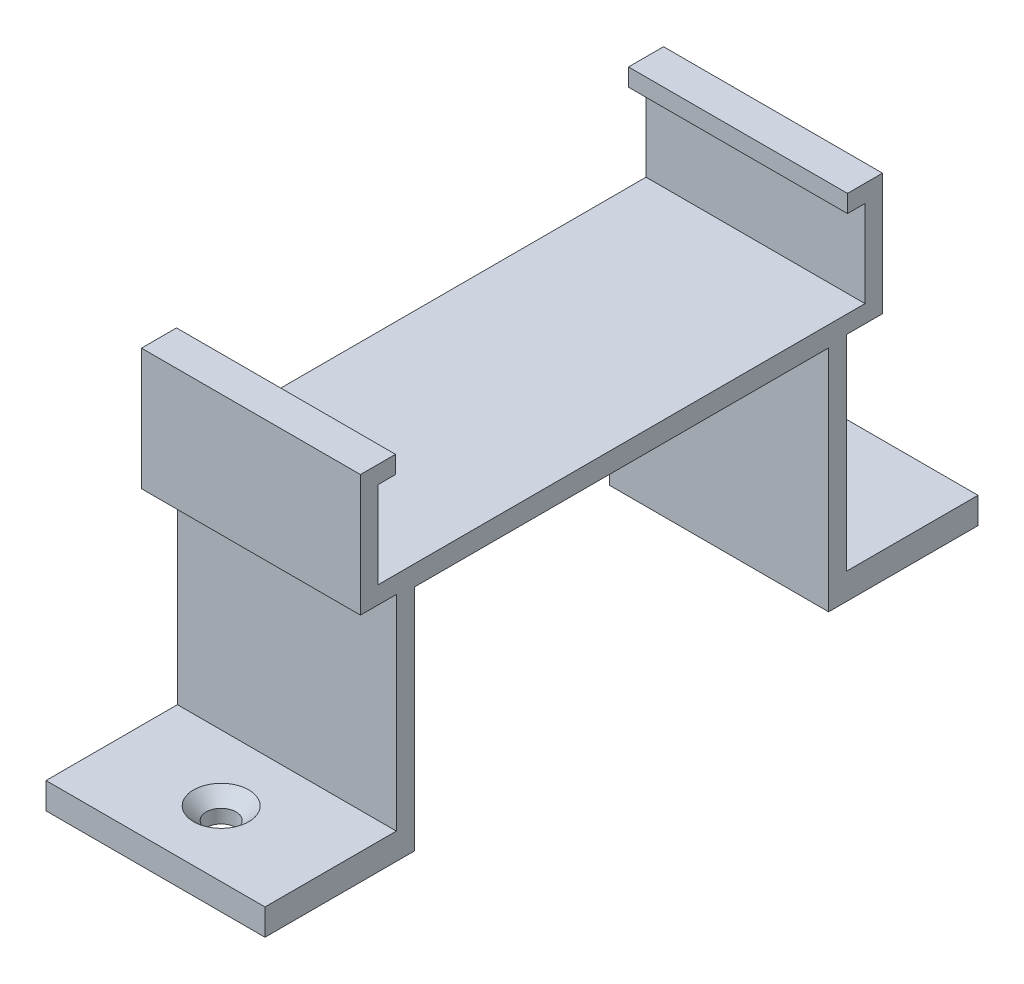
ISO-10303-21;
HEADER;
FILE_DESCRIPTION(('STEP AP214'),'2;1');
FILE_NAME('part.step','',(''),(''),'','','');
FILE_SCHEMA(('AUTOMOTIVE_DESIGN { 1 0 10303 214 1 1 1 1 }'));
ENDSEC;
DATA;
#1=APPLICATION_CONTEXT('core data for automotive mechanical design processes');
#2=APPLICATION_PROTOCOL_DEFINITION('international standard','automotive_design',2000,#1);
#3=PRODUCT_CONTEXT('',#1,'mechanical');
#4=PRODUCT('Part','Part','',(#3));
#5=PRODUCT_RELATED_PRODUCT_CATEGORY('part','',(#4));
#6=PRODUCT_DEFINITION_FORMATION('','',#4);
#7=PRODUCT_DEFINITION_CONTEXT('part definition',#1,'design');
#8=PRODUCT_DEFINITION('design','',#6,#7);
#9=PRODUCT_DEFINITION_SHAPE('','',#8);
#10=(LENGTH_UNIT() NAMED_UNIT(*) SI_UNIT(.MILLI.,.METRE.));
#11=(NAMED_UNIT(*) PLANE_ANGLE_UNIT() SI_UNIT($,.RADIAN.));
#12=(NAMED_UNIT(*) SI_UNIT($,.STERADIAN.) SOLID_ANGLE_UNIT());
#13=UNCERTAINTY_MEASURE_WITH_UNIT(LENGTH_MEASURE(1.E-05),#10,'distance_accuracy_value','');
#14=(GEOMETRIC_REPRESENTATION_CONTEXT(3) GLOBAL_UNCERTAINTY_ASSIGNED_CONTEXT((#13)) GLOBAL_UNIT_ASSIGNED_CONTEXT((#10,
#11,#12)) REPRESENTATION_CONTEXT('',''));
#15=CARTESIAN_POINT('',(0.,0.,0.));
#16=DIRECTION('',(0.,0.,1.));
#17=DIRECTION('',(1.,0.,0.));
#18=AXIS2_PLACEMENT_3D('',#15,#16,#17);
#19=CARTESIAN_POINT('',(-12.5,28.4,25.7));
#20=DIRECTION('',(0.,0.,-1.));
#21=DIRECTION('',(-1.,0.,0.));
#22=AXIS2_PLACEMENT_3D('',#19,#20,#21);
#23=PLANE('',#22);
#24=DIRECTION('',(-1.,0.,0.));
#25=VECTOR('',#24,1.);
#26=CARTESIAN_POINT('',(-12.5,3.,25.7));
#27=LINE('',#26,#25);
#28=CARTESIAN_POINT('',(12.5,3.,25.7));
#29=VERTEX_POINT('',#28);
#30=CARTESIAN_POINT('',(-12.5,3.,25.7));
#31=VERTEX_POINT('',#30);
#32=EDGE_CURVE('E63',#29,#31,#27,.T.);
#33=ORIENTED_EDGE('',*,*,#32,.F.);
#34=DIRECTION('',(0.,-1.,0.));
#35=VECTOR('',#34,1.);
#36=CARTESIAN_POINT('',(12.5,28.4,25.7));
#37=LINE('',#36,#35);
#38=CARTESIAN_POINT('',(12.5,26.4,25.7));
#39=VERTEX_POINT('',#38);
#40=EDGE_CURVE('E438',#39,#29,#37,.T.);
#41=ORIENTED_EDGE('',*,*,#40,.F.);
#42=DIRECTION('',(-1.,0.,0.));
#43=VECTOR('',#42,1.);
#44=CARTESIAN_POINT('',(-12.5,26.4,25.7));
#45=LINE('',#44,#43);
#46=CARTESIAN_POINT('',(-12.5,26.4,25.7));
#47=VERTEX_POINT('',#46);
#48=EDGE_CURVE('E11',#39,#47,#45,.T.);
#49=ORIENTED_EDGE('',*,*,#48,.T.);
#50=DIRECTION('',(0.,-1.,0.));
#51=VECTOR('',#50,1.);
#52=CARTESIAN_POINT('',(-12.5,28.4,25.7));
#53=LINE('',#52,#51);
#54=EDGE_CURVE('E441',#47,#31,#53,.T.);
#55=ORIENTED_EDGE('',*,*,#54,.T.);
#56=EDGE_LOOP('',(#33,#41,#49,#55));
#57=FACE_BOUND('',#56,.T.);
#58=ADVANCED_FACE('F45',(#57),#23,.F.);
#59=CARTESIAN_POINT('',(-12.5,28.4,-25.7));
#60=DIRECTION('',(0.,0.,1.));
#61=DIRECTION('',(1.,0.,0.));
#62=AXIS2_PLACEMENT_3D('',#59,#60,#61);
#63=PLANE('',#62);
#64=DIRECTION('',(1.,0.,0.));
#65=VECTOR('',#64,1.);
#66=CARTESIAN_POINT('',(12.5,3.,-25.7));
#67=LINE('',#66,#65);
#68=CARTESIAN_POINT('',(-12.5,3.,-25.7));
#69=VERTEX_POINT('',#68);
#70=CARTESIAN_POINT('',(12.5,3.,-25.7));
#71=VERTEX_POINT('',#70);
#72=EDGE_CURVE('E257',#69,#71,#67,.T.);
#73=ORIENTED_EDGE('',*,*,#72,.F.);
#74=DIRECTION('',(0.,-1.,0.));
#75=VECTOR('',#74,1.);
#76=CARTESIAN_POINT('',(-12.5,28.4,-25.7));
#77=LINE('',#76,#75);
#78=CARTESIAN_POINT('',(-12.5,26.4,-25.7));
#79=VERTEX_POINT('',#78);
#80=EDGE_CURVE('E444',#79,#69,#77,.T.);
#81=ORIENTED_EDGE('',*,*,#80,.F.);
#82=DIRECTION('',(1.,0.,0.));
#83=VECTOR('',#82,1.);
#84=CARTESIAN_POINT('',(-12.5,26.4,-25.7));
#85=LINE('',#84,#83);
#86=CARTESIAN_POINT('',(12.5,26.4,-25.7));
#87=VERTEX_POINT('',#86);
#88=EDGE_CURVE('E397',#79,#87,#85,.T.);
#89=ORIENTED_EDGE('',*,*,#88,.T.);
#90=DIRECTION('',(0.,-1.,0.));
#91=VECTOR('',#90,1.);
#92=CARTESIAN_POINT('',(12.5,28.4,-25.7));
#93=LINE('',#92,#91);
#94=EDGE_CURVE('E71',#87,#71,#93,.T.);
#95=ORIENTED_EDGE('',*,*,#94,.T.);
#96=EDGE_LOOP('',(#73,#81,#89,#95));
#97=FACE_BOUND('',#96,.T.);
#98=ADVANCED_FACE('F544',(#97),#63,.F.);
#99=CARTESIAN_POINT('',(0.,40.3,0.));
#100=DIRECTION('',(0.,-1.,0.));
#101=DIRECTION('',(0.,0.,-1.));
#102=AXIS2_PLACEMENT_3D('',#99,#100,#101);
#103=PLANE('',#102);
#104=DIRECTION('',(0.,0.,1.));
#105=VECTOR('',#104,1.);
#106=CARTESIAN_POINT('',(-12.5,40.3,-29.8));
#107=LINE('',#106,#105);
#108=CARTESIAN_POINT('',(-12.5,40.3,-29.8));
#109=VERTEX_POINT('',#108);
#110=CARTESIAN_POINT('',(-12.5,40.3,-25.8));
#111=VERTEX_POINT('',#110);
#112=EDGE_CURVE('E367',#109,#111,#107,.T.);
#113=ORIENTED_EDGE('',*,*,#112,.T.);
#114=DIRECTION('',(-1.,0.,0.));
#115=VECTOR('',#114,1.);
#116=CARTESIAN_POINT('',(12.5,40.3,-25.8));
#117=LINE('',#116,#115);
#118=CARTESIAN_POINT('',(12.5,40.3,-25.8));
#119=VERTEX_POINT('',#118);
#120=EDGE_CURVE('E297',#119,#111,#117,.T.);
#121=ORIENTED_EDGE('',*,*,#120,.F.);
#122=DIRECTION('',(0.,0.,-1.));
#123=VECTOR('',#122,1.);
#124=CARTESIAN_POINT('',(12.5,40.3,-29.8));
#125=LINE('',#124,#123);
#126=CARTESIAN_POINT('',(12.5,40.3,-29.8));
#127=VERTEX_POINT('',#126);
#128=EDGE_CURVE('E348',#119,#127,#125,.T.);
#129=ORIENTED_EDGE('',*,*,#128,.T.);
#130=DIRECTION('',(-1.,0.,0.));
#131=VECTOR('',#130,1.);
#132=CARTESIAN_POINT('',(12.5,40.3,-29.8));
#133=LINE('',#132,#131);
#134=EDGE_CURVE('E362',#127,#109,#133,.T.);
#135=ORIENTED_EDGE('',*,*,#134,.T.);
#136=EDGE_LOOP('',(#113,#121,#129,#135));
#137=FACE_BOUND('',#136,.T.);
#138=ADVANCED_FACE('F526',(#137),#103,.F.);
#139=CARTESIAN_POINT('',(12.5,38.3,-27.8));
#140=DIRECTION('',(0.,1.,0.));
#141=DIRECTION('',(0.,0.,1.));
#142=AXIS2_PLACEMENT_3D('',#139,#140,#141);
#143=PLANE('',#142);
#144=DIRECTION('',(0.,0.,-1.));
#145=VECTOR('',#144,1.);
#146=CARTESIAN_POINT('',(12.5,38.3,-27.8));
#147=LINE('',#146,#145);
#148=CARTESIAN_POINT('',(12.5,38.3,-25.8));
#149=VERTEX_POINT('',#148);
#150=CARTESIAN_POINT('',(12.5,38.3,-27.8));
#151=VERTEX_POINT('',#150);
#152=EDGE_CURVE('E324',#149,#151,#147,.T.);
#153=ORIENTED_EDGE('',*,*,#152,.F.);
#154=DIRECTION('',(-1.,0.,0.));
#155=VECTOR('',#154,1.);
#156=CARTESIAN_POINT('',(12.5,38.3,-25.8));
#157=LINE('',#156,#155);
#158=CARTESIAN_POINT('',(-12.5,38.3,-25.8));
#159=VERTEX_POINT('',#158);
#160=EDGE_CURVE('E292',#149,#159,#157,.T.);
#161=ORIENTED_EDGE('',*,*,#160,.T.);
#162=DIRECTION('',(0.,0.,-1.));
#163=VECTOR('',#162,1.);
#164=CARTESIAN_POINT('',(-12.5,38.3,-27.8));
#165=LINE('',#164,#163);
#166=CARTESIAN_POINT('',(-12.5,38.3,-27.8));
#167=VERTEX_POINT('',#166);
#168=EDGE_CURVE('E340',#159,#167,#165,.T.);
#169=ORIENTED_EDGE('',*,*,#168,.T.);
#170=DIRECTION('',(-1.,0.,0.));
#171=VECTOR('',#170,1.);
#172=CARTESIAN_POINT('',(12.5,38.3,-27.8));
#173=LINE('',#172,#171);
#174=EDGE_CURVE('E344',#151,#167,#173,.T.);
#175=ORIENTED_EDGE('',*,*,#174,.F.);
#176=EDGE_LOOP('',(#153,#161,#169,#175));
#177=FACE_BOUND('',#176,.T.);
#178=ADVANCED_FACE('F507',(#177),#143,.F.);
#179=CARTESIAN_POINT('',(0.,0.,0.));
#180=DIRECTION('',(0.,-1.,0.));
#181=DIRECTION('',(0.,0.,-1.));
#182=AXIS2_PLACEMENT_3D('',#179,#180,#181);
#183=PLANE('',#182);
#184=CARTESIAN_POINT('',(0.,0.,33.2));
#185=DIRECTION('',(0.,-1.,0.));
#186=DIRECTION('',(0.,0.,-1.));
#187=AXIS2_PLACEMENT_3D('',#184,#185,#186);
#188=CIRCLE('',#187,1.69999999999999);
#189=CARTESIAN_POINT('',(0.,0.,31.5));
#190=VERTEX_POINT('',#189);
#191=EDGE_CURVE('E49',#190,#190,#188,.T.);
#192=ORIENTED_EDGE('',*,*,#191,.F.);
#193=EDGE_LOOP('',(#192));
#194=FACE_BOUND('',#193,.T.);
#195=DIRECTION('',(-1.,0.,0.));
#196=VECTOR('',#195,1.);
#197=CARTESIAN_POINT('',(0.,0.,23.65));
#198=LINE('',#197,#196);
#199=CARTESIAN_POINT('',(12.5,0.,23.65));
#200=VERTEX_POINT('',#199);
#201=CARTESIAN_POINT('',(-12.5,0.,23.65));
#202=VERTEX_POINT('',#201);
#203=EDGE_CURVE('E453',#200,#202,#198,.T.);
#204=ORIENTED_EDGE('',*,*,#203,.F.);
#205=DIRECTION('',(0.,0.,-1.));
#206=VECTOR('',#205,1.);
#207=CARTESIAN_POINT('',(12.5,0.,25.7));
#208=LINE('',#207,#206);
#209=CARTESIAN_POINT('',(12.5,0.,40.7));
#210=VERTEX_POINT('',#209);
#211=EDGE_CURVE('E222',#210,#200,#208,.T.);
#212=ORIENTED_EDGE('',*,*,#211,.F.);
#213=DIRECTION('',(1.,0.,0.));
#214=VECTOR('',#213,1.);
#215=CARTESIAN_POINT('',(-12.5,0.,40.7));
#216=LINE('',#215,#214);
#217=CARTESIAN_POINT('',(-12.5,0.,40.7));
#218=VERTEX_POINT('',#217);
#219=EDGE_CURVE('E225',#218,#210,#216,.T.);
#220=ORIENTED_EDGE('',*,*,#219,.F.);
#221=DIRECTION('',(0.,0.,1.));
#222=VECTOR('',#221,1.);
#223=CARTESIAN_POINT('',(-12.5,0.,25.7));
#224=LINE('',#223,#222);
#225=EDGE_CURVE('E209',#202,#218,#224,.T.);
#226=ORIENTED_EDGE('',*,*,#225,.F.);
#227=EDGE_LOOP('',(#204,#212,#220,#226));
#228=FACE_BOUND('',#227,.T.);
#229=ADVANCED_FACE('F226',(#194,#228),#183,.T.);
#230=CARTESIAN_POINT('',(12.5,28.4,25.7));
#231=DIRECTION('',(-1.,0.,0.));
#232=DIRECTION('',(0.,0.,1.));
#233=AXIS2_PLACEMENT_3D('',#230,#231,#232);
#234=PLANE('',#233);
#235=ORIENTED_EDGE('',*,*,#128,.F.);
#236=DIRECTION('',(0.,-1.,0.));
#237=VECTOR('',#236,1.);
#238=CARTESIAN_POINT('',(12.5,38.3,-25.8));
#239=LINE('',#238,#237);
#240=EDGE_CURVE('E283',#119,#149,#239,.T.);
#241=ORIENTED_EDGE('',*,*,#240,.T.);
#242=ORIENTED_EDGE('',*,*,#152,.T.);
#243=DIRECTION('',(0.,-1.,0.));
#244=VECTOR('',#243,1.);
#245=CARTESIAN_POINT('',(12.5,28.4,-27.8));
#246=LINE('',#245,#244);
#247=CARTESIAN_POINT('',(12.5,28.4,-27.8));
#248=VERTEX_POINT('',#247);
#249=EDGE_CURVE('E311',#151,#248,#246,.T.);
#250=ORIENTED_EDGE('',*,*,#249,.T.);
#251=DIRECTION('',(0.,0.,1.));
#252=VECTOR('',#251,1.);
#253=CARTESIAN_POINT('',(12.5,28.4,-27.8));
#254=LINE('',#253,#252);
#255=CARTESIAN_POINT('',(12.5,28.4,27.8));
#256=VERTEX_POINT('',#255);
#257=EDGE_CURVE('E315',#248,#256,#254,.T.);
#258=ORIENTED_EDGE('',*,*,#257,.T.);
#259=DIRECTION('',(0.,1.,0.));
#260=VECTOR('',#259,1.);
#261=CARTESIAN_POINT('',(12.5,28.4,27.8));
#262=LINE('',#261,#260);
#263=CARTESIAN_POINT('',(12.5,38.3,27.8));
#264=VERTEX_POINT('',#263);
#265=EDGE_CURVE('E320',#256,#264,#262,.T.);
#266=ORIENTED_EDGE('',*,*,#265,.T.);
#267=CARTESIAN_POINT('',(12.5,38.3,25.8));
#268=VERTEX_POINT('',#267);
#269=EDGE_CURVE('E325',#264,#268,#147,.T.);
#270=ORIENTED_EDGE('',*,*,#269,.T.);
#271=DIRECTION('',(0.,1.,0.));
#272=VECTOR('',#271,1.);
#273=CARTESIAN_POINT('',(12.5,38.3,25.8));
#274=LINE('',#273,#272);
#275=CARTESIAN_POINT('',(12.5,40.3,25.8));
#276=VERTEX_POINT('',#275);
#277=EDGE_CURVE('E287',#268,#276,#274,.T.);
#278=ORIENTED_EDGE('',*,*,#277,.T.);
#279=CARTESIAN_POINT('',(12.5,40.3,29.8));
#280=VERTEX_POINT('',#279);
#281=EDGE_CURVE('E358',#280,#276,#125,.T.);
#282=ORIENTED_EDGE('',*,*,#281,.F.);
#283=DIRECTION('',(0.,1.,0.));
#284=VECTOR('',#283,1.);
#285=CARTESIAN_POINT('',(12.5,26.4,29.8));
#286=LINE('',#285,#284);
#287=CARTESIAN_POINT('',(12.5,26.4,29.8));
#288=VERTEX_POINT('',#287);
#289=EDGE_CURVE('E394',#288,#280,#286,.T.);
#290=ORIENTED_EDGE('',*,*,#289,.F.);
#291=DIRECTION('',(0.,0.,-1.));
#292=VECTOR('',#291,1.);
#293=CARTESIAN_POINT('',(12.5,26.4,-29.8));
#294=LINE('',#293,#292);
#295=EDGE_CURVE('E376',#288,#39,#294,.T.);
#296=ORIENTED_EDGE('',*,*,#295,.T.);
#297=ORIENTED_EDGE('',*,*,#40,.T.);
#298=DIRECTION('',(0.,0.,-1.));
#299=VECTOR('',#298,1.);
#300=CARTESIAN_POINT('',(12.5,3.,40.7));
#301=LINE('',#300,#299);
#302=CARTESIAN_POINT('',(12.5,3.,40.7));
#303=VERTEX_POINT('',#302);
#304=EDGE_CURVE('E253',#303,#29,#301,.T.);
#305=ORIENTED_EDGE('',*,*,#304,.F.);
#306=DIRECTION('',(0.,1.,0.));
#307=VECTOR('',#306,1.);
#308=CARTESIAN_POINT('',(12.5,3.,40.7));
#309=LINE('',#308,#307);
#310=EDGE_CURVE('E231',#210,#303,#309,.T.);
#311=ORIENTED_EDGE('',*,*,#310,.F.);
#312=ORIENTED_EDGE('',*,*,#211,.T.);
#313=DIRECTION('',(0.,-1.,0.));
#314=VECTOR('',#313,1.);
#315=CARTESIAN_POINT('',(12.5,26.1,23.65));
#316=LINE('',#315,#314);
#317=CARTESIAN_POINT('',(12.5,26.1,23.65));
#318=VERTEX_POINT('',#317);
#319=EDGE_CURVE('E410',#318,#200,#316,.T.);
#320=ORIENTED_EDGE('',*,*,#319,.F.);
#321=DIRECTION('',(0.,0.,1.));
#322=VECTOR('',#321,1.);
#323=CARTESIAN_POINT('',(12.5,26.1,23.65));
#324=LINE('',#323,#322);
#325=CARTESIAN_POINT('',(12.5,26.1,-23.65));
#326=VERTEX_POINT('',#325);
#327=EDGE_CURVE('E417',#326,#318,#324,.T.);
#328=ORIENTED_EDGE('',*,*,#327,.F.);
#329=DIRECTION('',(0.,1.,0.));
#330=VECTOR('',#329,1.);
#331=CARTESIAN_POINT('',(12.5,26.1,-23.65));
#332=LINE('',#331,#330);
#333=CARTESIAN_POINT('',(12.5,0.,-23.65));
#334=VERTEX_POINT('',#333);
#335=EDGE_CURVE('E413',#334,#326,#332,.T.);
#336=ORIENTED_EDGE('',*,*,#335,.F.);
#337=CARTESIAN_POINT('',(12.5,0.,-40.7));
#338=VERTEX_POINT('',#337);
#339=EDGE_CURVE('E433',#334,#338,#208,.T.);
#340=ORIENTED_EDGE('',*,*,#339,.T.);
#341=DIRECTION('',(0.,-1.,0.));
#342=VECTOR('',#341,1.);
#343=CARTESIAN_POINT('',(12.5,3.,-40.7));
#344=LINE('',#343,#342);
#345=CARTESIAN_POINT('',(12.5,3.,-40.7));
#346=VERTEX_POINT('',#345);
#347=EDGE_CURVE('E258',#346,#338,#344,.T.);
#348=ORIENTED_EDGE('',*,*,#347,.F.);
#349=DIRECTION('',(0.,0.,1.));
#350=VECTOR('',#349,1.);
#351=CARTESIAN_POINT('',(12.5,3.,-40.7));
#352=LINE('',#351,#350);
#353=EDGE_CURVE('E272',#346,#71,#352,.T.);
#354=ORIENTED_EDGE('',*,*,#353,.T.);
#355=ORIENTED_EDGE('',*,*,#94,.F.);
#356=CARTESIAN_POINT('',(12.5,26.4,-29.8));
#357=VERTEX_POINT('',#356);
#358=EDGE_CURVE('E375',#87,#357,#294,.T.);
#359=ORIENTED_EDGE('',*,*,#358,.T.);
#360=DIRECTION('',(0.,1.,0.));
#361=VECTOR('',#360,1.);
#362=CARTESIAN_POINT('',(12.5,26.4,-29.8));
#363=LINE('',#362,#361);
#364=EDGE_CURVE('E393',#357,#127,#363,.T.);
#365=ORIENTED_EDGE('',*,*,#364,.T.);
#366=EDGE_LOOP('',(#235,#241,#242,#250,#258,#266,#270,#278,#282,#290,#296,#297,#305,#311,#312,
#320,#328,#336,#340,#348,#354,#355,#359,#365));
#367=FACE_BOUND('',#366,.T.);
#368=ADVANCED_FACE('F47',(#367),#234,.F.);
#369=CARTESIAN_POINT('',(-12.5,28.4,25.7));
#370=DIRECTION('',(1.,0.,0.));
#371=DIRECTION('',(0.,0.,-1.));
#372=AXIS2_PLACEMENT_3D('',#369,#370,#371);
#373=PLANE('',#372);
#374=ORIENTED_EDGE('',*,*,#168,.F.);
#375=DIRECTION('',(0.,-1.,0.));
#376=VECTOR('',#375,1.);
#377=CARTESIAN_POINT('',(-12.5,38.3,-25.8));
#378=LINE('',#377,#376);
#379=EDGE_CURVE('E282',#111,#159,#378,.T.);
#380=ORIENTED_EDGE('',*,*,#379,.F.);
#381=ORIENTED_EDGE('',*,*,#112,.F.);
#382=DIRECTION('',(0.,1.,0.));
#383=VECTOR('',#382,1.);
#384=CARTESIAN_POINT('',(-12.5,26.4,-29.8));
#385=LINE('',#384,#383);
#386=CARTESIAN_POINT('',(-12.5,26.4,-29.8));
#387=VERTEX_POINT('',#386);
#388=EDGE_CURVE('E402',#387,#109,#385,.T.);
#389=ORIENTED_EDGE('',*,*,#388,.F.);
#390=DIRECTION('',(0.,0.,1.));
#391=VECTOR('',#390,1.);
#392=CARTESIAN_POINT('',(-12.5,26.4,-29.8));
#393=LINE('',#392,#391);
#394=EDGE_CURVE('E385',#387,#79,#393,.T.);
#395=ORIENTED_EDGE('',*,*,#394,.T.);
#396=ORIENTED_EDGE('',*,*,#80,.T.);
#397=DIRECTION('',(0.,0.,1.));
#398=VECTOR('',#397,1.);
#399=CARTESIAN_POINT('',(-12.5,3.,-40.7));
#400=LINE('',#399,#398);
#401=CARTESIAN_POINT('',(-12.5,3.,-40.7));
#402=VERTEX_POINT('',#401);
#403=EDGE_CURVE('E278',#402,#69,#400,.T.);
#404=ORIENTED_EDGE('',*,*,#403,.F.);
#405=DIRECTION('',(0.,1.,0.));
#406=VECTOR('',#405,1.);
#407=CARTESIAN_POINT('',(-12.5,3.,-40.7));
#408=LINE('',#407,#406);
#409=CARTESIAN_POINT('',(-12.5,0.,-40.7));
#410=VERTEX_POINT('',#409);
#411=EDGE_CURVE('E266',#410,#402,#408,.T.);
#412=ORIENTED_EDGE('',*,*,#411,.F.);
#413=CARTESIAN_POINT('',(-12.5,0.,-23.65));
#414=VERTEX_POINT('',#413);
#415=EDGE_CURVE('E221',#410,#414,#224,.T.);
#416=ORIENTED_EDGE('',*,*,#415,.T.);
#417=DIRECTION('',(0.,1.,0.));
#418=VECTOR('',#417,1.);
#419=CARTESIAN_POINT('',(-12.5,28.4,-23.65));
#420=LINE('',#419,#418);
#421=CARTESIAN_POINT('',(-12.5,26.1,-23.65));
#422=VERTEX_POINT('',#421);
#423=EDGE_CURVE('E425',#414,#422,#420,.T.);
#424=ORIENTED_EDGE('',*,*,#423,.T.);
#425=DIRECTION('',(0.,0.,1.));
#426=VECTOR('',#425,1.);
#427=CARTESIAN_POINT('',(-12.5,26.1,25.7));
#428=LINE('',#427,#426);
#429=CARTESIAN_POINT('',(-12.5,26.1,23.65));
#430=VERTEX_POINT('',#429);
#431=EDGE_CURVE('E55',#422,#430,#428,.T.);
#432=ORIENTED_EDGE('',*,*,#431,.T.);
#433=DIRECTION('',(0.,-1.,0.));
#434=VECTOR('',#433,1.);
#435=CARTESIAN_POINT('',(-12.5,28.4,23.65));
#436=LINE('',#435,#434);
#437=EDGE_CURVE('E217',#430,#202,#436,.T.);
#438=ORIENTED_EDGE('',*,*,#437,.T.);
#439=ORIENTED_EDGE('',*,*,#225,.T.);
#440=DIRECTION('',(0.,-1.,0.));
#441=VECTOR('',#440,1.);
#442=CARTESIAN_POINT('',(-12.5,3.,40.7));
#443=LINE('',#442,#441);
#444=CARTESIAN_POINT('',(-12.5,3.,40.7));
#445=VERTEX_POINT('',#444);
#446=EDGE_CURVE('E215',#445,#218,#443,.T.);
#447=ORIENTED_EDGE('',*,*,#446,.F.);
#448=DIRECTION('',(0.,0.,-1.));
#449=VECTOR('',#448,1.);
#450=CARTESIAN_POINT('',(-12.5,3.,40.7));
#451=LINE('',#450,#449);
#452=EDGE_CURVE('E249',#445,#31,#451,.T.);
#453=ORIENTED_EDGE('',*,*,#452,.T.);
#454=ORIENTED_EDGE('',*,*,#54,.F.);
#455=CARTESIAN_POINT('',(-12.5,26.4,29.8));
#456=VERTEX_POINT('',#455);
#457=EDGE_CURVE('E384',#47,#456,#393,.T.);
#458=ORIENTED_EDGE('',*,*,#457,.T.);
#459=DIRECTION('',(0.,1.,0.));
#460=VECTOR('',#459,1.);
#461=CARTESIAN_POINT('',(-12.5,26.4,29.8));
#462=LINE('',#461,#460);
#463=CARTESIAN_POINT('',(-12.5,40.3,29.8));
#464=VERTEX_POINT('',#463);
#465=EDGE_CURVE('E398',#456,#464,#462,.T.);
#466=ORIENTED_EDGE('',*,*,#465,.T.);
#467=CARTESIAN_POINT('',(-12.5,40.3,25.8));
#468=VERTEX_POINT('',#467);
#469=EDGE_CURVE('E366',#468,#464,#107,.T.);
#470=ORIENTED_EDGE('',*,*,#469,.F.);
#471=DIRECTION('',(0.,1.,0.));
#472=VECTOR('',#471,1.);
#473=CARTESIAN_POINT('',(-12.5,38.3,25.8));
#474=LINE('',#473,#472);
#475=CARTESIAN_POINT('',(-12.5,38.3,25.8));
#476=VERTEX_POINT('',#475);
#477=EDGE_CURVE('E288',#476,#468,#474,.T.);
#478=ORIENTED_EDGE('',*,*,#477,.F.);
#479=CARTESIAN_POINT('',(-12.5,38.3,27.8));
#480=VERTEX_POINT('',#479);
#481=EDGE_CURVE('E316',#480,#476,#165,.T.);
#482=ORIENTED_EDGE('',*,*,#481,.F.);
#483=DIRECTION('',(0.,1.,0.));
#484=VECTOR('',#483,1.);
#485=CARTESIAN_POINT('',(-12.5,28.4,27.8));
#486=LINE('',#485,#484);
#487=CARTESIAN_POINT('',(-12.5,28.4,27.8));
#488=VERTEX_POINT('',#487);
#489=EDGE_CURVE('E336',#488,#480,#486,.T.);
#490=ORIENTED_EDGE('',*,*,#489,.F.);
#491=DIRECTION('',(0.,0.,1.));
#492=VECTOR('',#491,1.);
#493=CARTESIAN_POINT('',(-12.5,28.4,-27.8));
#494=LINE('',#493,#492);
#495=CARTESIAN_POINT('',(-12.5,28.4,-27.8));
#496=VERTEX_POINT('',#495);
#497=EDGE_CURVE('E332',#496,#488,#494,.T.);
#498=ORIENTED_EDGE('',*,*,#497,.F.);
#499=DIRECTION('',(0.,-1.,0.));
#500=VECTOR('',#499,1.);
#501=CARTESIAN_POINT('',(-12.5,28.4,-27.8));
#502=LINE('',#501,#500);
#503=EDGE_CURVE('E300',#167,#496,#502,.T.);
#504=ORIENTED_EDGE('',*,*,#503,.F.);
#505=EDGE_LOOP('',(#374,#380,#381,#389,#395,#396,#404,#412,#416,#424,#432,#438,#439,#447,#453,
#454,#458,#466,#470,#478,#482,#490,#498,#504));
#506=FACE_BOUND('',#505,.T.);
#507=ADVANCED_FACE('F212',(#506),#373,.F.);
#508=CARTESIAN_POINT('',(0.,0.,-33.2));
#509=DIRECTION('',(0.,-1.,0.));
#510=DIRECTION('',(0.,0.,-1.));
#511=AXIS2_PLACEMENT_3D('',#508,#509,#510);
#512=CIRCLE('',#511,1.69999999999999);
#513=CARTESIAN_POINT('',(0.,0.,-34.9));
#514=VERTEX_POINT('',#513);
#515=EDGE_CURVE('E240',#514,#514,#512,.T.);
#516=ORIENTED_EDGE('',*,*,#515,.F.);
#517=EDGE_LOOP('',(#516));
#518=FACE_BOUND('',#517,.T.);
#519=DIRECTION('',(1.,0.,0.));
#520=VECTOR('',#519,1.);
#521=CARTESIAN_POINT('',(0.,0.,-23.65));
#522=LINE('',#521,#520);
#523=EDGE_CURVE('E450',#414,#334,#522,.T.);
#524=ORIENTED_EDGE('',*,*,#523,.F.);
#525=ORIENTED_EDGE('',*,*,#415,.F.);
#526=DIRECTION('',(-1.,0.,0.));
#527=VECTOR('',#526,1.);
#528=CARTESIAN_POINT('',(12.5,0.,-40.7));
#529=LINE('',#528,#527);
#530=EDGE_CURVE('E262',#338,#410,#529,.T.);
#531=ORIENTED_EDGE('',*,*,#530,.F.);
#532=ORIENTED_EDGE('',*,*,#339,.F.);
#533=EDGE_LOOP('',(#524,#525,#531,#532));
#534=FACE_BOUND('',#533,.T.);
#535=ADVANCED_FACE('F551',(#518,#534),#183,.T.);
#536=CARTESIAN_POINT('',(-134.5,26.1,23.65));
#537=DIRECTION('',(0.,1.,0.));
#538=DIRECTION('',(0.,0.,1.));
#539=AXIS2_PLACEMENT_3D('',#536,#537,#538);
#540=PLANE('',#539);
#541=DIRECTION('',(1.,0.,0.));
#542=VECTOR('',#541,1.);
#543=CARTESIAN_POINT('',(-134.5,26.1,-23.65));
#544=LINE('',#543,#542);
#545=EDGE_CURVE('E421',#422,#326,#544,.T.);
#546=ORIENTED_EDGE('',*,*,#545,.T.);
#547=ORIENTED_EDGE('',*,*,#327,.T.);
#548=DIRECTION('',(1.,0.,0.));
#549=VECTOR('',#548,1.);
#550=CARTESIAN_POINT('',(-134.5,26.1,23.65));
#551=LINE('',#550,#549);
#552=EDGE_CURVE('E422',#430,#318,#551,.T.);
#553=ORIENTED_EDGE('',*,*,#552,.F.);
#554=ORIENTED_EDGE('',*,*,#431,.F.);
#555=EDGE_LOOP('',(#546,#547,#553,#554));
#556=FACE_BOUND('',#555,.T.);
#557=ADVANCED_FACE('F560',(#556),#540,.F.);
#558=CARTESIAN_POINT('',(-134.5,26.1,23.65));
#559=DIRECTION('',(0.,0.,1.));
#560=DIRECTION('',(0.,-1.,0.));
#561=AXIS2_PLACEMENT_3D('',#558,#559,#560);
#562=PLANE('',#561);
#563=ORIENTED_EDGE('',*,*,#552,.T.);
#564=ORIENTED_EDGE('',*,*,#319,.T.);
#565=ORIENTED_EDGE('',*,*,#203,.T.);
#566=ORIENTED_EDGE('',*,*,#437,.F.);
#567=EDGE_LOOP('',(#563,#564,#565,#566));
#568=FACE_BOUND('',#567,.T.);
#569=ADVANCED_FACE('F562',(#568),#562,.F.);
#570=CARTESIAN_POINT('',(-134.5,26.1,-23.65));
#571=DIRECTION('',(0.,0.,-1.));
#572=DIRECTION('',(0.,1.,0.));
#573=AXIS2_PLACEMENT_3D('',#570,#571,#572);
#574=PLANE('',#573);
#575=ORIENTED_EDGE('',*,*,#523,.T.);
#576=ORIENTED_EDGE('',*,*,#335,.T.);
#577=ORIENTED_EDGE('',*,*,#545,.F.);
#578=ORIENTED_EDGE('',*,*,#423,.F.);
#579=EDGE_LOOP('',(#575,#576,#577,#578));
#580=FACE_BOUND('',#579,.T.);
#581=ADVANCED_FACE('F554',(#580),#574,.F.);
#582=CARTESIAN_POINT('',(0.,26.4,0.));
#583=DIRECTION('',(0.,-1.,0.));
#584=DIRECTION('',(0.,0.,-1.));
#585=AXIS2_PLACEMENT_3D('',#582,#583,#584);
#586=PLANE('',#585);
#587=ORIENTED_EDGE('',*,*,#88,.F.);
#588=ORIENTED_EDGE('',*,*,#394,.F.);
#589=DIRECTION('',(-1.,0.,0.));
#590=VECTOR('',#589,1.);
#591=CARTESIAN_POINT('',(12.5,26.4,-29.8));
#592=LINE('',#591,#590);
#593=EDGE_CURVE('E380',#357,#387,#592,.T.);
#594=ORIENTED_EDGE('',*,*,#593,.F.);
#595=ORIENTED_EDGE('',*,*,#358,.F.);
#596=EDGE_LOOP('',(#587,#588,#594,#595));
#597=FACE_BOUND('',#596,.T.);
#598=ADVANCED_FACE('F534',(#597),#586,.T.);
#599=ORIENTED_EDGE('',*,*,#48,.F.);
#600=ORIENTED_EDGE('',*,*,#295,.F.);
#601=DIRECTION('',(1.,0.,0.));
#602=VECTOR('',#601,1.);
#603=CARTESIAN_POINT('',(12.5,26.4,29.8));
#604=LINE('',#603,#602);
#605=EDGE_CURVE('E389',#456,#288,#604,.T.);
#606=ORIENTED_EDGE('',*,*,#605,.F.);
#607=ORIENTED_EDGE('',*,*,#457,.F.);
#608=EDGE_LOOP('',(#599,#600,#606,#607));
#609=FACE_BOUND('',#608,.T.);
#610=ADVANCED_FACE('F496',(#609),#586,.T.);
#611=CARTESIAN_POINT('',(12.5,26.4,29.8));
#612=DIRECTION('',(0.,0.,1.));
#613=DIRECTION('',(1.,0.,0.));
#614=AXIS2_PLACEMENT_3D('',#611,#612,#613);
#615=PLANE('',#614);
#616=ORIENTED_EDGE('',*,*,#289,.T.);
#617=DIRECTION('',(1.,0.,0.));
#618=VECTOR('',#617,1.);
#619=CARTESIAN_POINT('',(12.5,40.3,29.8));
#620=LINE('',#619,#618);
#621=EDGE_CURVE('E371',#464,#280,#620,.T.);
#622=ORIENTED_EDGE('',*,*,#621,.F.);
#623=ORIENTED_EDGE('',*,*,#465,.F.);
#624=ORIENTED_EDGE('',*,*,#605,.T.);
#625=EDGE_LOOP('',(#616,#622,#623,#624));
#626=FACE_BOUND('',#625,.T.);
#627=ADVANCED_FACE('F635',(#626),#615,.T.);
#628=CARTESIAN_POINT('',(12.5,26.4,-29.8));
#629=DIRECTION('',(0.,0.,-1.));
#630=DIRECTION('',(-1.,0.,0.));
#631=AXIS2_PLACEMENT_3D('',#628,#629,#630);
#632=PLANE('',#631);
#633=ORIENTED_EDGE('',*,*,#388,.T.);
#634=ORIENTED_EDGE('',*,*,#134,.F.);
#635=ORIENTED_EDGE('',*,*,#364,.F.);
#636=ORIENTED_EDGE('',*,*,#593,.T.);
#637=EDGE_LOOP('',(#633,#634,#635,#636));
#638=FACE_BOUND('',#637,.T.);
#639=ADVANCED_FACE('F537',(#638),#632,.T.);
#640=ORIENTED_EDGE('',*,*,#281,.T.);
#641=DIRECTION('',(-1.,0.,0.));
#642=VECTOR('',#641,1.);
#643=CARTESIAN_POINT('',(12.5,40.3,25.8));
#644=LINE('',#643,#642);
#645=EDGE_CURVE('E301',#276,#468,#644,.T.);
#646=ORIENTED_EDGE('',*,*,#645,.T.);
#647=ORIENTED_EDGE('',*,*,#469,.T.);
#648=ORIENTED_EDGE('',*,*,#621,.T.);
#649=EDGE_LOOP('',(#640,#646,#647,#648));
#650=FACE_BOUND('',#649,.T.);
#651=ADVANCED_FACE('F629',(#650),#103,.F.);
#652=CARTESIAN_POINT('',(12.5,28.4,-27.8));
#653=DIRECTION('',(0.,0.,-1.));
#654=DIRECTION('',(-1.,0.,0.));
#655=AXIS2_PLACEMENT_3D('',#652,#653,#654);
#656=PLANE('',#655);
#657=ORIENTED_EDGE('',*,*,#503,.T.);
#658=DIRECTION('',(-1.,0.,0.));
#659=VECTOR('',#658,1.);
#660=CARTESIAN_POINT('',(12.5,28.4,-27.8));
#661=LINE('',#660,#659);
#662=EDGE_CURVE('E329',#248,#496,#661,.T.);
#663=ORIENTED_EDGE('',*,*,#662,.F.);
#664=ORIENTED_EDGE('',*,*,#249,.F.);
#665=ORIENTED_EDGE('',*,*,#174,.T.);
#666=EDGE_LOOP('',(#657,#663,#664,#665));
#667=FACE_BOUND('',#666,.T.);
#668=ADVANCED_FACE('F512',(#667),#656,.F.);
#669=ORIENTED_EDGE('',*,*,#481,.T.);
#670=DIRECTION('',(-1.,0.,0.));
#671=VECTOR('',#670,1.);
#672=CARTESIAN_POINT('',(12.5,38.3,25.8));
#673=LINE('',#672,#671);
#674=EDGE_CURVE('E305',#268,#476,#673,.T.);
#675=ORIENTED_EDGE('',*,*,#674,.F.);
#676=ORIENTED_EDGE('',*,*,#269,.F.);
#677=DIRECTION('',(-1.,0.,0.));
#678=VECTOR('',#677,1.);
#679=CARTESIAN_POINT('',(12.5,38.3,27.8));
#680=LINE('',#679,#678);
#681=EDGE_CURVE('E349',#264,#480,#680,.T.);
#682=ORIENTED_EDGE('',*,*,#681,.T.);
#683=EDGE_LOOP('',(#669,#675,#676,#682));
#684=FACE_BOUND('',#683,.T.);
#685=ADVANCED_FACE('F587',(#684),#143,.F.);
#686=CARTESIAN_POINT('',(12.5,28.4,27.8));
#687=DIRECTION('',(0.,0.,1.));
#688=DIRECTION('',(0.,-1.,0.));
#689=AXIS2_PLACEMENT_3D('',#686,#687,#688);
#690=PLANE('',#689);
#691=ORIENTED_EDGE('',*,*,#489,.T.);
#692=ORIENTED_EDGE('',*,*,#681,.F.);
#693=ORIENTED_EDGE('',*,*,#265,.F.);
#694=DIRECTION('',(-1.,0.,0.));
#695=VECTOR('',#694,1.);
#696=CARTESIAN_POINT('',(12.5,28.4,27.8));
#697=LINE('',#696,#695);
#698=EDGE_CURVE('E352',#256,#488,#697,.T.);
#699=ORIENTED_EDGE('',*,*,#698,.T.);
#700=EDGE_LOOP('',(#691,#692,#693,#699));
#701=FACE_BOUND('',#700,.T.);
#702=ADVANCED_FACE('F620',(#701),#690,.F.);
#703=CARTESIAN_POINT('',(12.5,28.4,-27.8));
#704=DIRECTION('',(0.,-1.,0.));
#705=DIRECTION('',(0.,0.,-1.));
#706=AXIS2_PLACEMENT_3D('',#703,#704,#705);
#707=PLANE('',#706);
#708=ORIENTED_EDGE('',*,*,#497,.T.);
#709=ORIENTED_EDGE('',*,*,#698,.F.);
#710=ORIENTED_EDGE('',*,*,#257,.F.);
#711=ORIENTED_EDGE('',*,*,#662,.T.);
#712=EDGE_LOOP('',(#708,#709,#710,#711));
#713=FACE_BOUND('',#712,.T.);
#714=ADVANCED_FACE('F518',(#713),#707,.F.);
#715=CARTESIAN_POINT('',(12.5,38.3,25.8));
#716=DIRECTION('',(0.,0.,1.));
#717=DIRECTION('',(0.,-1.,0.));
#718=AXIS2_PLACEMENT_3D('',#715,#716,#717);
#719=PLANE('',#718);
#720=ORIENTED_EDGE('',*,*,#477,.T.);
#721=ORIENTED_EDGE('',*,*,#645,.F.);
#722=ORIENTED_EDGE('',*,*,#277,.F.);
#723=ORIENTED_EDGE('',*,*,#674,.T.);
#724=EDGE_LOOP('',(#720,#721,#722,#723));
#725=FACE_BOUND('',#724,.T.);
#726=ADVANCED_FACE('F613',(#725),#719,.F.);
#727=CARTESIAN_POINT('',(12.5,38.3,-25.8));
#728=DIRECTION('',(0.,0.,-1.));
#729=DIRECTION('',(-1.,0.,0.));
#730=AXIS2_PLACEMENT_3D('',#727,#728,#729);
#731=PLANE('',#730);
#732=ORIENTED_EDGE('',*,*,#379,.T.);
#733=ORIENTED_EDGE('',*,*,#160,.F.);
#734=ORIENTED_EDGE('',*,*,#240,.F.);
#735=ORIENTED_EDGE('',*,*,#120,.T.);
#736=EDGE_LOOP('',(#732,#733,#734,#735));
#737=FACE_BOUND('',#736,.T.);
#738=ADVANCED_FACE('F524',(#737),#731,.F.);
#739=CARTESIAN_POINT('',(12.5,3.,-40.7));
#740=DIRECTION('',(0.,-1.,0.));
#741=DIRECTION('',(1.,0.,0.));
#742=AXIS2_PLACEMENT_3D('',#739,#740,#741);
#743=PLANE('',#742);
#744=CARTESIAN_POINT('',(0.,3.,-33.2));
#745=DIRECTION('',(0.,1.,0.));
#746=DIRECTION('',(0.,0.,1.));
#747=AXIS2_PLACEMENT_3D('',#744,#745,#746);
#748=CIRCLE('',#747,3.15);
#749=CARTESIAN_POINT('',(0.,3.,-30.05));
#750=VERTEX_POINT('',#749);
#751=EDGE_CURVE('E463',#750,#750,#748,.T.);
#752=ORIENTED_EDGE('',*,*,#751,.F.);
#753=EDGE_LOOP('',(#752));
#754=FACE_BOUND('',#753,.T.);
#755=ORIENTED_EDGE('',*,*,#72,.T.);
#756=ORIENTED_EDGE('',*,*,#353,.F.);
#757=DIRECTION('',(1.,0.,0.));
#758=VECTOR('',#757,1.);
#759=CARTESIAN_POINT('',(12.5,3.,-40.7));
#760=LINE('',#759,#758);
#761=EDGE_CURVE('E269',#402,#346,#760,.T.);
#762=ORIENTED_EDGE('',*,*,#761,.F.);
#763=ORIENTED_EDGE('',*,*,#403,.T.);
#764=EDGE_LOOP('',(#755,#756,#762,#763));
#765=FACE_BOUND('',#764,.T.);
#766=ADVANCED_FACE('F542',(#754,#765),#743,.F.);
#767=CARTESIAN_POINT('',(0.,0.,-40.7));
#768=DIRECTION('',(0.,0.,-1.));
#769=DIRECTION('',(-1.,0.,0.));
#770=AXIS2_PLACEMENT_3D('',#767,#768,#769);
#771=PLANE('',#770);
#772=ORIENTED_EDGE('',*,*,#347,.T.);
#773=ORIENTED_EDGE('',*,*,#530,.T.);
#774=ORIENTED_EDGE('',*,*,#411,.T.);
#775=ORIENTED_EDGE('',*,*,#761,.T.);
#776=EDGE_LOOP('',(#772,#773,#774,#775));
#777=FACE_BOUND('',#776,.T.);
#778=ADVANCED_FACE('F487',(#777),#771,.T.);
#779=CARTESIAN_POINT('',(-12.5,3.,40.7));
#780=DIRECTION('',(0.,-1.,0.));
#781=DIRECTION('',(1.,0.,0.));
#782=AXIS2_PLACEMENT_3D('',#779,#780,#781);
#783=PLANE('',#782);
#784=CARTESIAN_POINT('',(0.,3.,33.2));
#785=DIRECTION('',(0.,1.,0.));
#786=DIRECTION('',(0.,0.,1.));
#787=AXIS2_PLACEMENT_3D('',#784,#785,#786);
#788=CIRCLE('',#787,3.15);
#789=CARTESIAN_POINT('',(0.,3.,36.35));
#790=VERTEX_POINT('',#789);
#791=EDGE_CURVE('E477',#790,#790,#788,.T.);
#792=ORIENTED_EDGE('',*,*,#791,.F.);
#793=EDGE_LOOP('',(#792));
#794=FACE_BOUND('',#793,.T.);
#795=ORIENTED_EDGE('',*,*,#32,.T.);
#796=ORIENTED_EDGE('',*,*,#452,.F.);
#797=DIRECTION('',(-1.,0.,0.));
#798=VECTOR('',#797,1.);
#799=CARTESIAN_POINT('',(-12.5,3.,40.7));
#800=LINE('',#799,#798);
#801=EDGE_CURVE('E235',#303,#445,#800,.T.);
#802=ORIENTED_EDGE('',*,*,#801,.F.);
#803=ORIENTED_EDGE('',*,*,#304,.T.);
#804=EDGE_LOOP('',(#795,#796,#802,#803));
#805=FACE_BOUND('',#804,.T.);
#806=ADVANCED_FACE('F484',(#794,#805),#783,.F.);
#807=CARTESIAN_POINT('',(0.,0.,40.7));
#808=DIRECTION('',(0.,0.,1.));
#809=DIRECTION('',(1.,0.,0.));
#810=AXIS2_PLACEMENT_3D('',#807,#808,#809);
#811=PLANE('',#810);
#812=ORIENTED_EDGE('',*,*,#446,.T.);
#813=ORIENTED_EDGE('',*,*,#219,.T.);
#814=ORIENTED_EDGE('',*,*,#310,.T.);
#815=ORIENTED_EDGE('',*,*,#801,.T.);
#816=EDGE_LOOP('',(#812,#813,#814,#815));
#817=FACE_BOUND('',#816,.T.);
#818=ADVANCED_FACE('F233',(#817),#811,.T.);
#819=CARTESIAN_POINT('',(0.,3.,-33.2));
#820=DIRECTION('',(0.,1.,0.));
#821=DIRECTION('',(0.,0.,1.));
#822=AXIS2_PLACEMENT_3D('',#819,#820,#821);
#823=CYLINDRICAL_SURFACE('',#822,1.69999999999999);
#824=ORIENTED_EDGE('',*,*,#515,.T.);
#825=EDGE_LOOP('',(#824));
#826=FACE_BOUND('',#825,.T.);
#827=CARTESIAN_POINT('',(0.,1.54999999999999,-33.2));
#828=DIRECTION('',(0.,1.,0.));
#829=DIRECTION('',(0.,0.,1.));
#830=AXIS2_PLACEMENT_3D('',#827,#828,#829);
#831=CIRCLE('',#830,1.69999999999999);
#832=CARTESIAN_POINT('',(0.,1.54999999999999,-31.5));
#833=VERTEX_POINT('',#832);
#834=EDGE_CURVE('E243',#833,#833,#831,.T.);
#835=ORIENTED_EDGE('',*,*,#834,.T.);
#836=EDGE_LOOP('',(#835));
#837=FACE_BOUND('',#836,.T.);
#838=ADVANCED_FACE('F604',(#826,#837),#823,.F.);
#839=CARTESIAN_POINT('',(0.,3.,-33.2));
#840=DIRECTION('',(0.,1.,0.));
#841=DIRECTION('',(0.,0.,1.));
#842=AXIS2_PLACEMENT_3D('',#839,#840,#841);
#843=CONICAL_SURFACE('',#842,3.15,0.78539816339745);
#844=ORIENTED_EDGE('',*,*,#834,.F.);
#845=EDGE_LOOP('',(#844));
#846=FACE_BOUND('',#845,.T.);
#847=ORIENTED_EDGE('',*,*,#751,.T.);
#848=EDGE_LOOP('',(#847));
#849=FACE_BOUND('',#848,.T.);
#850=ADVANCED_FACE('F593',(#846,#849),#843,.F.);
#851=CARTESIAN_POINT('',(0.,3.,33.2));
#852=DIRECTION('',(0.,1.,0.));
#853=DIRECTION('',(0.,0.,1.));
#854=AXIS2_PLACEMENT_3D('',#851,#852,#853);
#855=CYLINDRICAL_SURFACE('',#854,1.69999999999999);
#856=ORIENTED_EDGE('',*,*,#191,.T.);
#857=EDGE_LOOP('',(#856));
#858=FACE_BOUND('',#857,.T.);
#859=CARTESIAN_POINT('',(0.,1.54999999999999,33.2));
#860=DIRECTION('',(0.,1.,0.));
#861=DIRECTION('',(0.,0.,1.));
#862=AXIS2_PLACEMENT_3D('',#859,#860,#861);
#863=CIRCLE('',#862,1.69999999999999);
#864=CARTESIAN_POINT('',(0.,1.54999999999999,34.9));
#865=VERTEX_POINT('',#864);
#866=EDGE_CURVE('E472',#865,#865,#863,.T.);
#867=ORIENTED_EDGE('',*,*,#866,.T.);
#868=EDGE_LOOP('',(#867));
#869=FACE_BOUND('',#868,.T.);
#870=ADVANCED_FACE('F590',(#858,#869),#855,.F.);
#871=CARTESIAN_POINT('',(0.,3.,33.2));
#872=DIRECTION('',(0.,1.,0.));
#873=DIRECTION('',(0.,0.,1.));
#874=AXIS2_PLACEMENT_3D('',#871,#872,#873);
#875=CONICAL_SURFACE('',#874,3.15,0.78539816339745);
#876=ORIENTED_EDGE('',*,*,#866,.F.);
#877=EDGE_LOOP('',(#876));
#878=FACE_BOUND('',#877,.T.);
#879=ORIENTED_EDGE('',*,*,#791,.T.);
#880=EDGE_LOOP('',(#879));
#881=FACE_BOUND('',#880,.T.);
#882=ADVANCED_FACE('F482',(#878,#881),#875,.F.);
#883=CLOSED_SHELL('',(#58,#98,#138,#178,#229,#368,#507,#535,#557,#569,#581,#598,#610,#627,#639,
#651,#668,#685,#702,#714,#726,#738,#766,#778,#806,#818,#838,#850,#870,#882));
#884=MANIFOLD_SOLID_BREP('B2',#883);
#885=ADVANCED_BREP_SHAPE_REPRESENTATION('',(#18,#884),#14);
#886=SHAPE_DEFINITION_REPRESENTATION(#9,#885);
ENDSEC;
END-ISO-10303-21;
